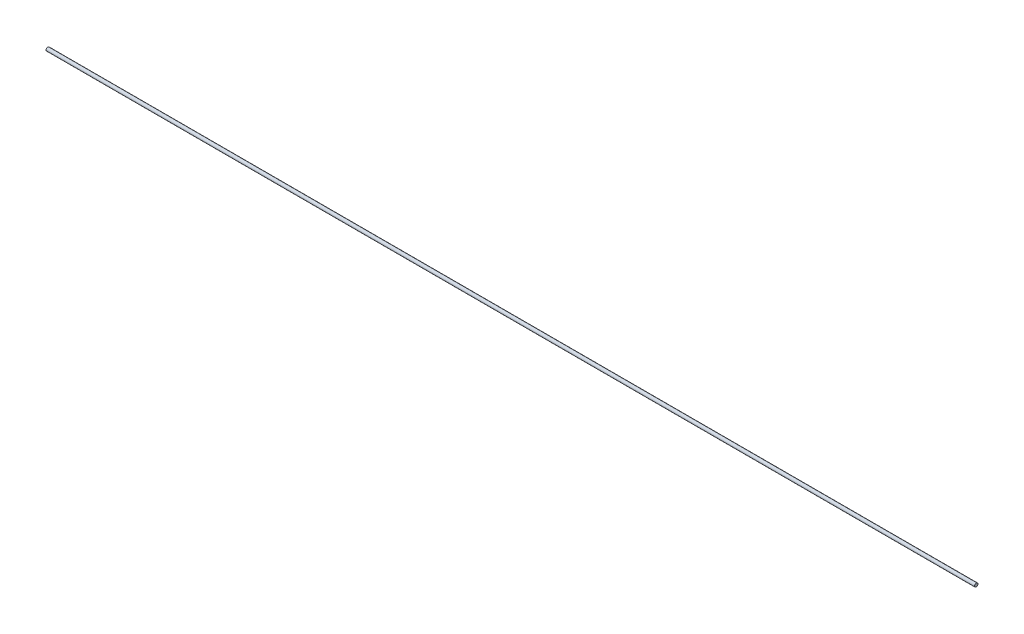
ISO-10303-21;
HEADER;
FILE_DESCRIPTION(('STEP AP214'),'2;1');
FILE_NAME('part.step','',(''),(''),'','','');
FILE_SCHEMA(('AUTOMOTIVE_DESIGN { 1 0 10303 214 1 1 1 1 }'));
ENDSEC;
DATA;
#1=APPLICATION_CONTEXT('core data for automotive mechanical design processes');
#2=APPLICATION_PROTOCOL_DEFINITION('international standard','automotive_design',2000,#1);
#3=PRODUCT_CONTEXT('',#1,'mechanical');
#4=PRODUCT('Part','Part','',(#3));
#5=PRODUCT_RELATED_PRODUCT_CATEGORY('part','',(#4));
#6=PRODUCT_DEFINITION_FORMATION('','',#4);
#7=PRODUCT_DEFINITION_CONTEXT('part definition',#1,'design');
#8=PRODUCT_DEFINITION('design','',#6,#7);
#9=PRODUCT_DEFINITION_SHAPE('','',#8);
#10=(LENGTH_UNIT() NAMED_UNIT(*) SI_UNIT(.MILLI.,.METRE.));
#11=(NAMED_UNIT(*) PLANE_ANGLE_UNIT() SI_UNIT($,.RADIAN.));
#12=(NAMED_UNIT(*) SI_UNIT($,.STERADIAN.) SOLID_ANGLE_UNIT());
#13=UNCERTAINTY_MEASURE_WITH_UNIT(LENGTH_MEASURE(1.E-05),#10,'distance_accuracy_value','');
#14=(GEOMETRIC_REPRESENTATION_CONTEXT(3) GLOBAL_UNCERTAINTY_ASSIGNED_CONTEXT((#13)) GLOBAL_UNIT_ASSIGNED_CONTEXT((#10,
#11,#12)) REPRESENTATION_CONTEXT('',''));
#15=CARTESIAN_POINT('',(0.,0.,0.));
#16=DIRECTION('',(0.,0.,1.));
#17=DIRECTION('',(1.,0.,0.));
#18=AXIS2_PLACEMENT_3D('',#15,#16,#17);
#19=CARTESIAN_POINT('',(0.,0.,0.));
#20=DIRECTION('',(1.,0.,0.));
#21=DIRECTION('',(0.,0.,-1.));
#22=AXIS2_PLACEMENT_3D('',#19,#20,#21);
#23=PLANE('',#22);
#24=CARTESIAN_POINT('',(0.,0.,0.));
#25=DIRECTION('',(-1.,0.,0.));
#26=DIRECTION('',(0.,0.,1.));
#27=AXIS2_PLACEMENT_3D('',#24,#25,#26);
#28=CIRCLE('',#27,3.175);
#29=CARTESIAN_POINT('',(0.,0.,3.175));
#30=VERTEX_POINT('',#29);
#31=EDGE_CURVE('E10',#30,#30,#28,.T.);
#32=ORIENTED_EDGE('',*,*,#31,.T.);
#33=EDGE_LOOP('',(#32));
#34=FACE_BOUND('',#33,.T.);
#35=ADVANCED_FACE('F31',(#34),#23,.F.);
#36=CARTESIAN_POINT('',(0.,0.,0.));
#37=DIRECTION('',(-1.,0.,0.));
#38=DIRECTION('',(0.,0.,1.));
#39=AXIS2_PLACEMENT_3D('',#36,#37,#38);
#40=CYLINDRICAL_SURFACE('',#39,3.175);
#41=ORIENTED_EDGE('',*,*,#31,.F.);
#42=EDGE_LOOP('',(#41));
#43=FACE_BOUND('',#42,.T.);
#44=CARTESIAN_POINT('',(1711.21761132835,0.,0.));
#45=DIRECTION('',(-1.,0.,0.));
#46=DIRECTION('',(0.,0.,1.));
#47=AXIS2_PLACEMENT_3D('',#44,#45,#46);
#48=CIRCLE('',#47,3.175);
#49=CARTESIAN_POINT('',(1711.21761132835,0.,3.175));
#50=VERTEX_POINT('',#49);
#51=EDGE_CURVE('E37',#50,#50,#48,.T.);
#52=ORIENTED_EDGE('',*,*,#51,.T.);
#53=EDGE_LOOP('',(#52));
#54=FACE_BOUND('',#53,.T.);
#55=ADVANCED_FACE('F43',(#43,#54),#40,.T.);
#56=CARTESIAN_POINT('',(1711.21761132835,3.175,0.));
#57=DIRECTION('',(-1.,0.,0.));
#58=DIRECTION('',(0.,0.,1.));
#59=AXIS2_PLACEMENT_3D('',#56,#57,#58);
#60=PLANE('',#59);
#61=ORIENTED_EDGE('',*,*,#51,.F.);
#62=EDGE_LOOP('',(#61));
#63=FACE_BOUND('',#62,.T.);
#64=ADVANCED_FACE('F45',(#63),#60,.F.);
#65=CLOSED_SHELL('',(#35,#55,#64));
#66=MANIFOLD_SOLID_BREP('B2',#65);
#67=ADVANCED_BREP_SHAPE_REPRESENTATION('',(#18,#66),#14);
#68=SHAPE_DEFINITION_REPRESENTATION(#9,#67);
ENDSEC;
END-ISO-10303-21;
